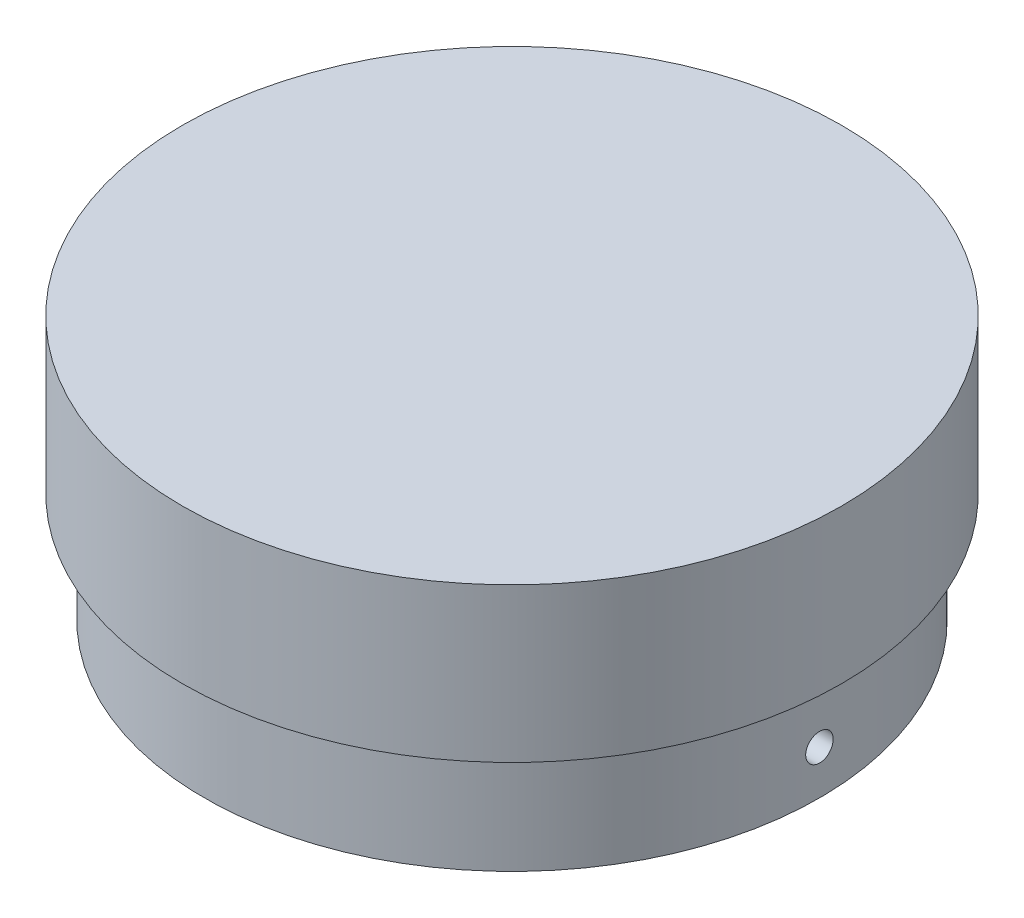
ISO-10303-21;
HEADER;
FILE_DESCRIPTION(('STEP AP214'),'2;1');
FILE_NAME('part.step','',(''),(''),'','','');
FILE_SCHEMA(('AUTOMOTIVE_DESIGN { 1 0 10303 214 1 1 1 1 }'));
ENDSEC;
DATA;
#1=APPLICATION_CONTEXT('core data for automotive mechanical design processes');
#2=APPLICATION_PROTOCOL_DEFINITION('international standard','automotive_design',2000,#1);
#3=PRODUCT_CONTEXT('',#1,'mechanical');
#4=PRODUCT('Part','Part','',(#3));
#5=PRODUCT_RELATED_PRODUCT_CATEGORY('part','',(#4));
#6=PRODUCT_DEFINITION_FORMATION('','',#4);
#7=PRODUCT_DEFINITION_CONTEXT('part definition',#1,'design');
#8=PRODUCT_DEFINITION('design','',#6,#7);
#9=PRODUCT_DEFINITION_SHAPE('','',#8);
#10=(LENGTH_UNIT() NAMED_UNIT(*) SI_UNIT(.MILLI.,.METRE.));
#11=(NAMED_UNIT(*) PLANE_ANGLE_UNIT() SI_UNIT($,.RADIAN.));
#12=(NAMED_UNIT(*) SI_UNIT($,.STERADIAN.) SOLID_ANGLE_UNIT());
#13=UNCERTAINTY_MEASURE_WITH_UNIT(LENGTH_MEASURE(1.E-05),#10,'distance_accuracy_value','');
#14=(GEOMETRIC_REPRESENTATION_CONTEXT(3) GLOBAL_UNCERTAINTY_ASSIGNED_CONTEXT((#13)) GLOBAL_UNIT_ASSIGNED_CONTEXT((#10,
#11,#12)) REPRESENTATION_CONTEXT('',''));
#15=CARTESIAN_POINT('',(0.,0.,0.));
#16=DIRECTION('',(0.,0.,1.));
#17=DIRECTION('',(1.,0.,0.));
#18=AXIS2_PLACEMENT_3D('',#15,#16,#17);
#19=CARTESIAN_POINT('',(0.,0.,0.));
#20=DIRECTION('',(0.,-1.,0.));
#21=DIRECTION('',(0.,0.,-1.));
#22=AXIS2_PLACEMENT_3D('',#19,#20,#21);
#23=PLANE('',#22);
#24=CARTESIAN_POINT('',(0.,0.,0.));
#25=DIRECTION('',(0.,-1.,0.));
#26=DIRECTION('',(0.,0.,-1.));
#27=AXIS2_PLACEMENT_3D('',#24,#25,#26);
#28=CIRCLE('',#27,88.9);
#29=CARTESIAN_POINT('',(0.,0.,-88.9));
#30=VERTEX_POINT('',#29);
#31=EDGE_CURVE('E43',#30,#30,#28,.T.);
#32=ORIENTED_EDGE('',*,*,#31,.T.);
#33=EDGE_LOOP('',(#32));
#34=FACE_BOUND('',#33,.T.);
#35=ADVANCED_FACE('F30',(#34),#23,.T.);
#36=CARTESIAN_POINT('',(0.,0.,0.));
#37=DIRECTION('',(0.,-1.,0.));
#38=DIRECTION('',(0.,0.,-1.));
#39=AXIS2_PLACEMENT_3D('',#36,#37,#38);
#40=CYLINDRICAL_SURFACE('',#39,88.9);
#41=CARTESIAN_POINT('',(-88.8113676476019,12.7,3.96875));
#42=CARTESIAN_POINT('',(-88.8113688399252,12.9228072236194,3.96874015661093));
#43=CARTESIAN_POINT('',(-88.812215115773,13.1457731760925,3.94992426336002));
#44=CARTESIAN_POINT('',(-88.8155094434425,13.5855563039247,3.87512961895862));
#45=CARTESIAN_POINT('',(-88.8179593907607,13.8023658858144,3.81910688918468));
#46=CARTESIAN_POINT('',(-88.8241829901547,14.2234017992276,3.671503923614));
#47=CARTESIAN_POINT('',(-88.827955975975,14.4276344035197,3.57994158237248));
#48=CARTESIAN_POINT('',(-88.8363996684118,14.8177749050446,3.36388542428388));
#49=CARTESIAN_POINT('',(-88.8410701607599,15.0036871600346,3.23939946486959));
#50=CARTESIAN_POINT('',(-88.8507870749941,15.3521209716347,2.96091278810014));
#51=CARTESIAN_POINT('',(-88.8558337678509,15.5146254160744,2.80689066831058));
#52=CARTESIAN_POINT('',(-88.8657318349937,15.8114851577384,2.47374563019555));
#53=CARTESIAN_POINT('',(-88.8705832013626,15.9458393148962,2.29462169575458));
#54=CARTESIAN_POINT('',(-88.8795458207067,16.1826280928812,1.91627281727385));
#55=CARTESIAN_POINT('',(-88.8836567772811,16.2850499425095,1.71703987277679));
#56=CARTESIAN_POINT('',(-88.8906726428302,16.4549845948731,1.30418491860127));
#57=CARTESIAN_POINT('',(-88.8935775595706,16.5224976223884,1.09056300158426));
#58=CARTESIAN_POINT('',(-88.8978522078776,16.6206545116013,0.655146396486763));
#59=CARTESIAN_POINT('',(-88.8992229713268,16.6513231561176,0.433357305539996));
#60=CARTESIAN_POINT('',(-88.9002782866416,16.6749971649383,-0.0122250008873527));
#61=CARTESIAN_POINT('',(-88.8999628497052,16.6680027793603,-0.236018203048908));
#62=CARTESIAN_POINT('',(-88.8976821858038,16.6165699068157,-0.679088255784406));
#63=CARTESIAN_POINT('',(-88.8957181347096,16.5721581076617,-0.898368211247236));
#64=CARTESIAN_POINT('',(-88.8903628632648,16.4471924461705,-1.32635725222457));
#65=CARTESIAN_POINT('',(-88.8869716378265,16.3666384549917,-1.53506630005234));
#66=CARTESIAN_POINT('',(-88.8791420564565,16.1716445448677,-1.93607502097127));
#67=CARTESIAN_POINT('',(-88.8747033241795,16.0571924433282,-2.12836876252697));
#68=CARTESIAN_POINT('',(-88.8652787150293,15.7976601129142,-2.4910234839896));
#69=CARTESIAN_POINT('',(-88.86029283512,15.65257971408,-2.66138434218019));
#70=CARTESIAN_POINT('',(-88.8503304096626,15.3357581616039,-2.97549299144961));
#71=CARTESIAN_POINT('',(-88.8453538760552,15.163993855678,-3.11921743169722));
#72=CARTESIAN_POINT('',(-88.8359755646559,14.7987616734585,-3.37579359457007));
#73=CARTESIAN_POINT('',(-88.8315737869951,14.6052937922161,-3.48864531015571));
#74=CARTESIAN_POINT('',(-88.8238416882366,14.2021324982375,-3.68027039064148));
#75=CARTESIAN_POINT('',(-88.8205113935466,13.9924386857556,-3.75904291564361));
#76=CARTESIAN_POINT('',(-88.8152988460355,13.5627841914989,-3.88025813873087));
#77=CARTESIAN_POINT('',(-88.8134165845291,13.3428235713127,-3.92270105472127));
#78=CARTESIAN_POINT('',(-88.8113139565725,12.899082662676,-3.97002345459361));
#79=CARTESIAN_POINT('',(-88.8110921570385,12.6753058351032,-3.97493533021496));
#80=CARTESIAN_POINT('',(-88.8123317240987,12.2301060237821,-3.94714071212834));
#81=CARTESIAN_POINT('',(-88.8137930862742,12.0086830338563,-3.91443431717466));
#82=CARTESIAN_POINT('',(-88.8182329505502,11.5745670708309,-3.81235842467993));
#83=CARTESIAN_POINT('',(-88.8212108404982,11.3618706126362,-3.74300371994909));
#84=CARTESIAN_POINT('',(-88.8283475852827,10.9511381238099,-3.56961490737911));
#85=CARTESIAN_POINT('',(-88.8325064455462,10.753102160554,-3.46558064017358));
#86=CARTESIAN_POINT('',(-88.8415398541952,10.377163086051,-3.22570260065976));
#87=CARTESIAN_POINT('',(-88.8464148916979,10.1992738823621,-3.08983705098122));
#88=CARTESIAN_POINT('',(-88.8563294323967,9.86881777962323,-2.79018503443773));
#89=CARTESIAN_POINT('',(-88.8613689364437,9.71625101157662,-2.62639842313453));
#90=CARTESIAN_POINT('',(-88.8710485603966,9.4406619625345,-2.27541457424071));
#91=CARTESIAN_POINT('',(-88.8756883961539,9.31766059194335,-2.08820090911595));
#92=CARTESIAN_POINT('',(-88.8840416783119,9.10483681904852,-1.69576049005136));
#93=CARTESIAN_POINT('',(-88.8877551281315,9.0150142942865,-1.49053380259845));
#94=CARTESIAN_POINT('',(-88.8938357432253,8.87113456441108,-1.06797108962952));
#95=CARTESIAN_POINT('',(-88.8962034139745,8.81706392962501,-0.850639644387483));
#96=CARTESIAN_POINT('',(-88.8993276250314,8.74617885262692,-0.409972334009687));
#97=CARTESIAN_POINT('',(-88.9000841719944,8.72936425651766,-0.186636493680743));
#98=CARTESIAN_POINT('',(-88.8999009013968,8.73347010636664,0.259492076970579));
#99=CARTESIAN_POINT('',(-88.8989625598497,8.75435771890673,0.482285110823982));
#100=CARTESIAN_POINT('',(-88.8954980806675,8.8332072765501,0.921198252023261));
#101=CARTESIAN_POINT('',(-88.8929719399846,8.89116929281593,1.13731834655991));
#102=CARTESIAN_POINT('',(-88.886616171687,9.04251599343406,1.55675864663464));
#103=CARTESIAN_POINT('',(-88.8827865295655,9.13590107201652,1.76007870968932));
#104=CARTESIAN_POINT('',(-88.8742547092237,9.35543652520815,2.14815491364384));
#105=CARTESIAN_POINT('',(-88.8695525592957,9.48158583744603,2.33291165618495));
#106=CARTESIAN_POINT('',(-88.8598005564529,9.76318345046014,2.67877879350925));
#107=CARTESIAN_POINT('',(-88.8547504411408,9.91865401902361,2.83987104999718));
#108=CARTESIAN_POINT('',(-88.8448732031957,10.2544779368165,3.13371720983893));
#109=CARTESIAN_POINT('',(-88.8400461358435,10.4348374109017,3.26646411720182));
#110=CARTESIAN_POINT('',(-88.8311566622954,10.8154385051872,3.49990095954338));
#111=CARTESIAN_POINT('',(-88.8270949173848,11.0156970933421,3.60056322288773));
#112=CARTESIAN_POINT('',(-88.8202050253652,11.4301392102301,3.76671736784572));
#113=CARTESIAN_POINT('',(-88.8173754174859,11.644305901869,3.83225091801625));
#114=CARTESIAN_POINT('',(-88.8140203749059,11.9998419772996,3.90904139665434));
#115=CARTESIAN_POINT('',(-88.8130299685581,12.1389068900858,3.93140366776006));
#116=CARTESIAN_POINT('',(-88.8117032286088,12.418626764697,3.96126107281878));
#117=CARTESIAN_POINT('',(-88.8113668945667,12.5592817254508,3.96875621678554));
#118=CARTESIAN_POINT('',(-88.8113676476019,12.7,3.96875));
#119=B_SPLINE_CURVE_WITH_KNOTS('',3,(#41,#42,#43,#44,#45,#46,#47,#48,#49,#50,#51,#52,#53,#54,
#55,#56,#57,#58,#59,#60,#61,#62,#63,#64,#65,#66,#67,#68,#69,#70,#71,#72,#73,#74,#75,#76,#77,#78,
#79,#80,#81,#82,#83,#84,#85,#86,#87,#88,#89,#90,#91,#92,#93,#94,#95,#96,#97,#98,#99,#100,#101,
#102,#103,#104,#105,#106,#107,#108,#109,#110,#111,#112,#113,#114,#115,#116,#117,#118),
.UNSPECIFIED.,.T.,.F.,(4,2,2,2,2,2,2,2,2,2,2,2,2,2,2,2,2,2,2,2,2,2,2,2,2,2,2,2,2,2,2,2,2,2,2,2,
2,2,4),(0.,0.667908006500037,1.33660689123865,2.00496951515683,2.67317277375666,
3.34186206669429,4.01057843583891,4.67956191335302,5.34854108318976,6.01707002188226,
6.68559452092293,7.35364260095061,8.02169306249391,8.6899839056899,9.3582784574001,
10.0271561269483,10.6960339490143,11.3649282549561,12.033818548837,12.7021314814226,
13.3704426595783,14.0384842848624,14.7065289801061,15.3750320596574,16.0435385975424,
16.712516560837,17.3814920550057,18.0502161153741,18.718937413372,19.3870766283977,
20.0552171258887,20.7233650594636,21.3914913312287,22.0601270642529,22.7289276347743,
23.3983034661449,24.0668835383997,24.488714231366,24.9105446402078),.UNSPECIFIED.);
#120=CARTESIAN_POINT('',(-88.8113676476019,12.7,3.96875));
#121=VERTEX_POINT('',#120);
#122=EDGE_CURVE('E10',#121,#121,#119,.T.);
#123=ORIENTED_EDGE('',*,*,#122,.F.);
#124=EDGE_LOOP('',(#123));
#125=FACE_BOUND('',#124,.T.);
#126=CARTESIAN_POINT('',(88.8113676476019,12.7,-3.96875));
#127=CARTESIAN_POINT('',(88.8113688399252,12.9228072236194,-3.96874015661093));
#128=CARTESIAN_POINT('',(88.812215115773,13.1457731760925,-3.94992426336002));
#129=CARTESIAN_POINT('',(88.8155094434425,13.5855563039247,-3.87512961895862));
#130=CARTESIAN_POINT('',(88.8179593907607,13.8023658858144,-3.81910688918468));
#131=CARTESIAN_POINT('',(88.8241829901547,14.2234017992276,-3.671503923614));
#132=CARTESIAN_POINT('',(88.827955975975,14.4276344035197,-3.57994158237248));
#133=CARTESIAN_POINT('',(88.8363996684118,14.8177749050446,-3.36388542428388));
#134=CARTESIAN_POINT('',(88.8410701607599,15.0036871600346,-3.23939946486959));
#135=CARTESIAN_POINT('',(88.8507870749941,15.3521209716347,-2.96091278810014));
#136=CARTESIAN_POINT('',(88.8558337678509,15.5146254160744,-2.80689066831058));
#137=CARTESIAN_POINT('',(88.8657318349937,15.8114851577384,-2.47374563019555));
#138=CARTESIAN_POINT('',(88.8705832013626,15.9458393148962,-2.29462169575458));
#139=CARTESIAN_POINT('',(88.8795458207067,16.1826280928812,-1.91627281727385));
#140=CARTESIAN_POINT('',(88.8836567772811,16.2850499425095,-1.71703987277679));
#141=CARTESIAN_POINT('',(88.8906726428302,16.4549845948731,-1.30418491860127));
#142=CARTESIAN_POINT('',(88.8935775595706,16.5224976223884,-1.09056300158426));
#143=CARTESIAN_POINT('',(88.8978522078776,16.6206545116013,-0.655146396486763));
#144=CARTESIAN_POINT('',(88.8992229713268,16.6513231561176,-0.433357305539996));
#145=CARTESIAN_POINT('',(88.9002782866416,16.6749971649383,0.0122250008873527));
#146=CARTESIAN_POINT('',(88.8999628497052,16.6680027793603,0.236018203048908));
#147=CARTESIAN_POINT('',(88.8976821858038,16.6165699068157,0.679088255784406));
#148=CARTESIAN_POINT('',(88.8957181347096,16.5721581076617,0.898368211247236));
#149=CARTESIAN_POINT('',(88.8903628632648,16.4471924461705,1.32635725222457));
#150=CARTESIAN_POINT('',(88.8869716378265,16.3666384549917,1.53506630005234));
#151=CARTESIAN_POINT('',(88.8791420564565,16.1716445448677,1.93607502097127));
#152=CARTESIAN_POINT('',(88.8747033241795,16.0571924433282,2.12836876252697));
#153=CARTESIAN_POINT('',(88.8652787150293,15.7976601129142,2.4910234839896));
#154=CARTESIAN_POINT('',(88.86029283512,15.65257971408,2.66138434218019));
#155=CARTESIAN_POINT('',(88.8503304096626,15.3357581616039,2.97549299144961));
#156=CARTESIAN_POINT('',(88.8453538760552,15.163993855678,3.11921743169722));
#157=CARTESIAN_POINT('',(88.8359755646559,14.7987616734585,3.37579359457007));
#158=CARTESIAN_POINT('',(88.8315737869951,14.6052937922161,3.48864531015571));
#159=CARTESIAN_POINT('',(88.8238416882366,14.2021324982375,3.68027039064148));
#160=CARTESIAN_POINT('',(88.8205113935466,13.9924386857556,3.75904291564361));
#161=CARTESIAN_POINT('',(88.8152988460355,13.5627841914989,3.88025813873087));
#162=CARTESIAN_POINT('',(88.8134165845291,13.3428235713127,3.92270105472127));
#163=CARTESIAN_POINT('',(88.8113139565725,12.899082662676,3.97002345459361));
#164=CARTESIAN_POINT('',(88.8110921570385,12.6753058351032,3.97493533021496));
#165=CARTESIAN_POINT('',(88.8123317240987,12.2301060237821,3.94714071212834));
#166=CARTESIAN_POINT('',(88.8137930862742,12.0086830338563,3.91443431717466));
#167=CARTESIAN_POINT('',(88.8182329505502,11.5745670708309,3.81235842467993));
#168=CARTESIAN_POINT('',(88.8212108404982,11.3618706126362,3.74300371994909));
#169=CARTESIAN_POINT('',(88.8283475852827,10.9511381238099,3.56961490737911));
#170=CARTESIAN_POINT('',(88.8325064455462,10.753102160554,3.46558064017358));
#171=CARTESIAN_POINT('',(88.8415398541952,10.377163086051,3.22570260065976));
#172=CARTESIAN_POINT('',(88.8464148916979,10.1992738823621,3.08983705098122));
#173=CARTESIAN_POINT('',(88.8563294323967,9.86881777962323,2.79018503443773));
#174=CARTESIAN_POINT('',(88.8613689364437,9.71625101157662,2.62639842313453));
#175=CARTESIAN_POINT('',(88.8710485603966,9.4406619625345,2.27541457424071));
#176=CARTESIAN_POINT('',(88.8756883961539,9.31766059194335,2.08820090911595));
#177=CARTESIAN_POINT('',(88.8840416783119,9.10483681904852,1.69576049005136));
#178=CARTESIAN_POINT('',(88.8877551281315,9.0150142942865,1.49053380259845));
#179=CARTESIAN_POINT('',(88.8938357432253,8.87113456441108,1.06797108962952));
#180=CARTESIAN_POINT('',(88.8962034139745,8.81706392962501,0.850639644387483));
#181=CARTESIAN_POINT('',(88.8993276250314,8.74617885262692,0.409972334009687));
#182=CARTESIAN_POINT('',(88.9000841719944,8.72936425651766,0.186636493680743));
#183=CARTESIAN_POINT('',(88.8999009013968,8.73347010636664,-0.259492076970579));
#184=CARTESIAN_POINT('',(88.8989625598497,8.75435771890673,-0.482285110823982));
#185=CARTESIAN_POINT('',(88.8954980806675,8.8332072765501,-0.921198252023261));
#186=CARTESIAN_POINT('',(88.8929719399846,8.89116929281593,-1.13731834655991));
#187=CARTESIAN_POINT('',(88.886616171687,9.04251599343406,-1.55675864663464));
#188=CARTESIAN_POINT('',(88.8827865295655,9.13590107201652,-1.76007870968932));
#189=CARTESIAN_POINT('',(88.8742547092237,9.35543652520815,-2.14815491364384));
#190=CARTESIAN_POINT('',(88.8695525592957,9.48158583744603,-2.33291165618495));
#191=CARTESIAN_POINT('',(88.8598005564529,9.76318345046014,-2.67877879350925));
#192=CARTESIAN_POINT('',(88.8547504411408,9.91865401902361,-2.83987104999718));
#193=CARTESIAN_POINT('',(88.8448732031957,10.2544779368165,-3.13371720983893));
#194=CARTESIAN_POINT('',(88.8400461358435,10.4348374109017,-3.26646411720182));
#195=CARTESIAN_POINT('',(88.8311566622954,10.8154385051872,-3.49990095954338));
#196=CARTESIAN_POINT('',(88.8270949173848,11.0156970933421,-3.60056322288773));
#197=CARTESIAN_POINT('',(88.8202050253652,11.4301392102301,-3.76671736784572));
#198=CARTESIAN_POINT('',(88.8173754174859,11.644305901869,-3.83225091801625));
#199=CARTESIAN_POINT('',(88.8140203749059,11.9998419772996,-3.90904139665434));
#200=CARTESIAN_POINT('',(88.8130299685581,12.1389068900858,-3.93140366776006));
#201=CARTESIAN_POINT('',(88.8117032286088,12.418626764697,-3.96126107281878));
#202=CARTESIAN_POINT('',(88.8113668945667,12.5592817254508,-3.96875621678554));
#203=CARTESIAN_POINT('',(88.8113676476019,12.7,-3.96875));
#204=B_SPLINE_CURVE_WITH_KNOTS('',3,(#126,#127,#128,#129,#130,#131,#132,#133,#134,#135,#136,
#137,#138,#139,#140,#141,#142,#143,#144,#145,#146,#147,#148,#149,#150,#151,#152,#153,#154,#155,
#156,#157,#158,#159,#160,#161,#162,#163,#164,#165,#166,#167,#168,#169,#170,#171,#172,#173,#174,
#175,#176,#177,#178,#179,#180,#181,#182,#183,#184,#185,#186,#187,#188,#189,#190,#191,#192,#193,
#194,#195,#196,#197,#198,#199,#200,#201,#202,#203),.UNSPECIFIED.,.T.,.F.,(4,2,2,2,2,2,2,2,2,2,2,
2,2,2,2,2,2,2,2,2,2,2,2,2,2,2,2,2,2,2,2,2,2,2,2,2,2,2,4),(0.,0.667908006500037,1.33660689123865,
2.00496951515683,2.67317277375666,3.34186206669429,4.01057843583891,4.67956191335302,
5.34854108318976,6.01707002188226,6.68559452092293,7.35364260095061,8.02169306249391,
8.6899839056899,9.3582784574001,10.0271561269483,10.6960339490143,11.3649282549561,
12.033818548837,12.7021314814226,13.3704426595783,14.0384842848624,14.7065289801061,
15.3750320596574,16.0435385975424,16.712516560837,17.3814920550057,18.0502161153741,
18.718937413372,19.3870766283977,20.0552171258887,20.7233650594636,21.3914913312287,
22.0601270642529,22.7289276347743,23.3983034661449,24.0668835383997,24.488714231366,
24.9105446402078),.UNSPECIFIED.);
#205=CARTESIAN_POINT('',(88.8113676476019,12.7,-3.96875));
#206=VERTEX_POINT('',#205);
#207=EDGE_CURVE('E39',#206,#206,#204,.T.);
#208=ORIENTED_EDGE('',*,*,#207,.F.);
#209=EDGE_LOOP('',(#208));
#210=FACE_BOUND('',#209,.T.);
#211=CARTESIAN_POINT('',(0.,31.75,0.));
#212=DIRECTION('',(0.,-1.,0.));
#213=DIRECTION('',(0.,0.,-1.));
#214=AXIS2_PLACEMENT_3D('',#211,#212,#213);
#215=CIRCLE('',#214,88.9);
#216=CARTESIAN_POINT('',(0.,31.75,-88.9));
#217=VERTEX_POINT('',#216);
#218=EDGE_CURVE('E47',#217,#217,#215,.T.);
#219=ORIENTED_EDGE('',*,*,#218,.T.);
#220=EDGE_LOOP('',(#219));
#221=FACE_BOUND('',#220,.T.);
#222=ORIENTED_EDGE('',*,*,#31,.F.);
#223=EDGE_LOOP('',(#222));
#224=FACE_BOUND('',#223,.T.);
#225=ADVANCED_FACE('F53',(#125,#210,#221,#224),#40,.T.);
#226=CARTESIAN_POINT('',(88.9,31.75,0.));
#227=DIRECTION('',(0.,-1.,0.));
#228=DIRECTION('',(0.,0.,-1.));
#229=AXIS2_PLACEMENT_3D('',#226,#227,#228);
#230=PLANE('',#229);
#231=CARTESIAN_POINT('',(0.,31.75,0.));
#232=DIRECTION('',(0.,-1.,0.));
#233=DIRECTION('',(0.,0.,-1.));
#234=AXIS2_PLACEMENT_3D('',#231,#232,#233);
#235=CIRCLE('',#234,95.25);
#236=CARTESIAN_POINT('',(0.,31.75,-95.25));
#237=VERTEX_POINT('',#236);
#238=EDGE_CURVE('E129',#237,#237,#235,.T.);
#239=ORIENTED_EDGE('',*,*,#238,.T.);
#240=EDGE_LOOP('',(#239));
#241=FACE_BOUND('',#240,.T.);
#242=ORIENTED_EDGE('',*,*,#218,.F.);
#243=EDGE_LOOP('',(#242));
#244=FACE_BOUND('',#243,.T.);
#245=ADVANCED_FACE('F68',(#241,#244),#230,.T.);
#246=CARTESIAN_POINT('',(0.,0.,0.));
#247=DIRECTION('',(0.,-1.,0.));
#248=DIRECTION('',(0.,0.,-1.));
#249=AXIS2_PLACEMENT_3D('',#246,#247,#248);
#250=CYLINDRICAL_SURFACE('',#249,95.25);
#251=CARTESIAN_POINT('',(0.,76.2,0.));
#252=DIRECTION('',(0.,-1.,0.));
#253=DIRECTION('',(0.,0.,-1.));
#254=AXIS2_PLACEMENT_3D('',#251,#252,#253);
#255=CIRCLE('',#254,95.25);
#256=CARTESIAN_POINT('',(0.,76.2,-95.25));
#257=VERTEX_POINT('',#256);
#258=EDGE_CURVE('E124',#257,#257,#255,.T.);
#259=ORIENTED_EDGE('',*,*,#258,.T.);
#260=EDGE_LOOP('',(#259));
#261=FACE_BOUND('',#260,.T.);
#262=ORIENTED_EDGE('',*,*,#238,.F.);
#263=EDGE_LOOP('',(#262));
#264=FACE_BOUND('',#263,.T.);
#265=ADVANCED_FACE('F65',(#261,#264),#250,.T.);
#266=CARTESIAN_POINT('',(95.25,76.2,0.));
#267=DIRECTION('',(0.,1.,0.));
#268=DIRECTION('',(0.,0.,1.));
#269=AXIS2_PLACEMENT_3D('',#266,#267,#268);
#270=PLANE('',#269);
#271=ORIENTED_EDGE('',*,*,#258,.F.);
#272=EDGE_LOOP('',(#271));
#273=FACE_BOUND('',#272,.T.);
#274=ADVANCED_FACE('F62',(#273),#270,.T.);
#275=CARTESIAN_POINT('',(76.2,12.7,0.));
#276=DIRECTION('',(1.,0.,0.));
#277=DIRECTION('',(0.,0.,-1.));
#278=AXIS2_PLACEMENT_3D('',#275,#276,#277);
#279=CYLINDRICAL_SURFACE('',#278,3.96875);
#280=ORIENTED_EDGE('',*,*,#207,.T.);
#281=EDGE_LOOP('',(#280));
#282=FACE_BOUND('',#281,.T.);
#283=CARTESIAN_POINT('',(76.2,12.7,0.));
#284=DIRECTION('',(1.,0.,0.));
#285=DIRECTION('',(0.,0.,-1.));
#286=AXIS2_PLACEMENT_3D('',#283,#284,#285);
#287=CIRCLE('',#286,3.96875);
#288=CARTESIAN_POINT('',(76.2,12.7,-3.96875));
#289=VERTEX_POINT('',#288);
#290=EDGE_CURVE('E121',#289,#289,#287,.T.);
#291=ORIENTED_EDGE('',*,*,#290,.F.);
#292=EDGE_LOOP('',(#291));
#293=FACE_BOUND('',#292,.T.);
#294=ADVANCED_FACE('F56',(#282,#293),#279,.F.);
#295=CARTESIAN_POINT('',(76.2,12.7,0.));
#296=DIRECTION('',(1.,0.,0.));
#297=DIRECTION('',(0.,0.,-1.));
#298=AXIS2_PLACEMENT_3D('',#295,#296,#297);
#299=PLANE('',#298);
#300=ORIENTED_EDGE('',*,*,#290,.T.);
#301=EDGE_LOOP('',(#300));
#302=FACE_BOUND('',#301,.T.);
#303=ADVANCED_FACE('F61',(#302),#299,.T.);
#304=CARTESIAN_POINT('',(-76.2,12.7,0.));
#305=DIRECTION('',(-1.,0.,0.));
#306=DIRECTION('',(0.,0.,1.));
#307=AXIS2_PLACEMENT_3D('',#304,#305,#306);
#308=CYLINDRICAL_SURFACE('',#307,3.96875);
#309=ORIENTED_EDGE('',*,*,#122,.T.);
#310=EDGE_LOOP('',(#309));
#311=FACE_BOUND('',#310,.T.);
#312=CARTESIAN_POINT('',(-76.2,12.7,0.));
#313=DIRECTION('',(-1.,0.,0.));
#314=DIRECTION('',(0.,0.,1.));
#315=AXIS2_PLACEMENT_3D('',#312,#313,#314);
#316=CIRCLE('',#315,3.96875);
#317=CARTESIAN_POINT('',(-76.2,12.7,3.96875));
#318=VERTEX_POINT('',#317);
#319=EDGE_CURVE('E119',#318,#318,#316,.T.);
#320=ORIENTED_EDGE('',*,*,#319,.F.);
#321=EDGE_LOOP('',(#320));
#322=FACE_BOUND('',#321,.T.);
#323=ADVANCED_FACE('F99',(#311,#322),#308,.F.);
#324=CARTESIAN_POINT('',(-76.2,12.7,0.));
#325=DIRECTION('',(-1.,0.,0.));
#326=DIRECTION('',(0.,0.,1.));
#327=AXIS2_PLACEMENT_3D('',#324,#325,#326);
#328=PLANE('',#327);
#329=ORIENTED_EDGE('',*,*,#319,.T.);
#330=EDGE_LOOP('',(#329));
#331=FACE_BOUND('',#330,.T.);
#332=ADVANCED_FACE('F104',(#331),#328,.T.);
#333=CLOSED_SHELL('',(#35,#225,#245,#265,#274,#294,#303,#323,#332));
#334=MANIFOLD_SOLID_BREP('B2',#333);
#335=ADVANCED_BREP_SHAPE_REPRESENTATION('',(#18,#334),#14);
#336=SHAPE_DEFINITION_REPRESENTATION(#9,#335);
ENDSEC;
END-ISO-10303-21;
